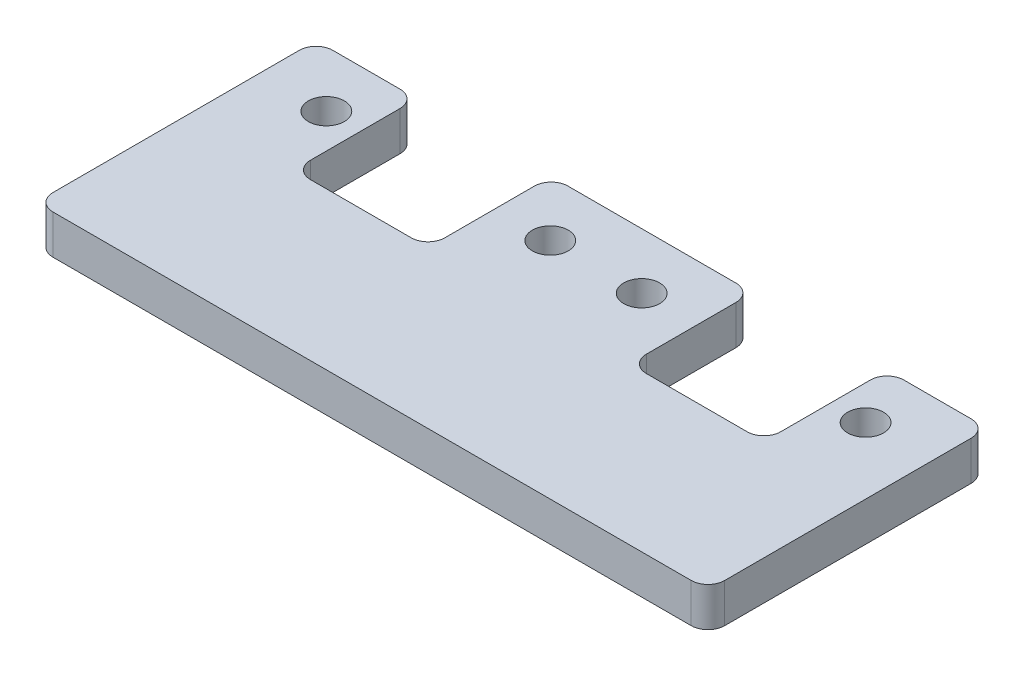
ISO-10303-21;
HEADER;
FILE_DESCRIPTION(('STEP AP214'),'2;1');
FILE_NAME('part.step','',(''),(''),'','','');
FILE_SCHEMA(('AUTOMOTIVE_DESIGN { 1 0 10303 214 1 1 1 1 }'));
ENDSEC;
DATA;
#1=APPLICATION_CONTEXT('core data for automotive mechanical design processes');
#2=APPLICATION_PROTOCOL_DEFINITION('international standard','automotive_design',2000,#1);
#3=PRODUCT_CONTEXT('',#1,'mechanical');
#4=PRODUCT('Part','Part','',(#3));
#5=PRODUCT_RELATED_PRODUCT_CATEGORY('part','',(#4));
#6=PRODUCT_DEFINITION_FORMATION('','',#4);
#7=PRODUCT_DEFINITION_CONTEXT('part definition',#1,'design');
#8=PRODUCT_DEFINITION('design','',#6,#7);
#9=PRODUCT_DEFINITION_SHAPE('','',#8);
#10=(LENGTH_UNIT() NAMED_UNIT(*) SI_UNIT(.MILLI.,.METRE.));
#11=(NAMED_UNIT(*) PLANE_ANGLE_UNIT() SI_UNIT($,.RADIAN.));
#12=(NAMED_UNIT(*) SI_UNIT($,.STERADIAN.) SOLID_ANGLE_UNIT());
#13=UNCERTAINTY_MEASURE_WITH_UNIT(LENGTH_MEASURE(1.E-05),#10,'distance_accuracy_value','');
#14=(GEOMETRIC_REPRESENTATION_CONTEXT(3) GLOBAL_UNCERTAINTY_ASSIGNED_CONTEXT((#13)) GLOBAL_UNIT_ASSIGNED_CONTEXT((#10,
#11,#12)) REPRESENTATION_CONTEXT('',''));
#15=CARTESIAN_POINT('',(0.,0.,0.));
#16=DIRECTION('',(0.,0.,1.));
#17=DIRECTION('',(1.,0.,0.));
#18=AXIS2_PLACEMENT_3D('',#15,#16,#17);
#19=CARTESIAN_POINT('',(21.,3.5,-12.5));
#20=DIRECTION('',(0.,0.,1.));
#21=DIRECTION('',(1.,0.,0.));
#22=AXIS2_PLACEMENT_3D('',#19,#20,#21);
#23=PLANE('',#22);
#24=DIRECTION('',(-1.,0.,0.));
#25=VECTOR('',#24,1.);
#26=CARTESIAN_POINT('',(21.,3.5,-12.5));
#27=LINE('',#26,#25);
#28=CARTESIAN_POINT('',(28.5,3.5,-12.5));
#29=VERTEX_POINT('',#28);
#30=CARTESIAN_POINT('',(22.5,3.5,-12.5));
#31=VERTEX_POINT('',#30);
#32=EDGE_CURVE('E222',#29,#31,#27,.T.);
#33=ORIENTED_EDGE('',*,*,#32,.F.);
#34=DIRECTION('',(0.,-1.,0.));
#35=VECTOR('',#34,1.);
#36=CARTESIAN_POINT('',(28.5,3.5,-12.5));
#37=LINE('',#36,#35);
#38=CARTESIAN_POINT('',(28.5,0.,-12.5));
#39=VERTEX_POINT('',#38);
#40=EDGE_CURVE('E207',#29,#39,#37,.T.);
#41=ORIENTED_EDGE('',*,*,#40,.T.);
#42=DIRECTION('',(-1.,0.,0.));
#43=VECTOR('',#42,1.);
#44=CARTESIAN_POINT('',(21.,0.,-12.5));
#45=LINE('',#44,#43);
#46=CARTESIAN_POINT('',(22.5,0.,-12.5));
#47=VERTEX_POINT('',#46);
#48=EDGE_CURVE('E219',#39,#47,#45,.T.);
#49=ORIENTED_EDGE('',*,*,#48,.T.);
#50=DIRECTION('',(0.,-1.,0.));
#51=VECTOR('',#50,1.);
#52=CARTESIAN_POINT('',(22.5,3.5,-12.5));
#53=LINE('',#52,#51);
#54=EDGE_CURVE('E224',#47,#31,#53,.F.);
#55=ORIENTED_EDGE('',*,*,#54,.T.);
#56=EDGE_LOOP('',(#33,#41,#49,#55));
#57=FACE_BOUND('',#56,.T.);
#58=ADVANCED_FACE('F41',(#57),#23,.F.);
#59=CARTESIAN_POINT('',(21.,3.5,-1.5));
#60=DIRECTION('',(1.,0.,0.));
#61=DIRECTION('',(0.,0.,-1.));
#62=AXIS2_PLACEMENT_3D('',#59,#60,#61);
#63=PLANE('',#62);
#64=DIRECTION('',(0.,0.,1.));
#65=VECTOR('',#64,1.);
#66=CARTESIAN_POINT('',(21.,0.,-1.5));
#67=LINE('',#66,#65);
#68=CARTESIAN_POINT('',(21.,0.,-11.));
#69=VERTEX_POINT('',#68);
#70=CARTESIAN_POINT('',(21.,0.,-3.));
#71=VERTEX_POINT('',#70);
#72=EDGE_CURVE('E229',#69,#71,#67,.T.);
#73=ORIENTED_EDGE('',*,*,#72,.T.);
#74=DIRECTION('',(0.,-1.,0.));
#75=VECTOR('',#74,1.);
#76=CARTESIAN_POINT('',(21.,3.5,-3.));
#77=LINE('',#76,#75);
#78=CARTESIAN_POINT('',(21.,3.5,-3.));
#79=VERTEX_POINT('',#78);
#80=EDGE_CURVE('E346',#71,#79,#77,.F.);
#81=ORIENTED_EDGE('',*,*,#80,.T.);
#82=DIRECTION('',(0.,0.,1.));
#83=VECTOR('',#82,1.);
#84=CARTESIAN_POINT('',(21.,3.5,-1.5));
#85=LINE('',#84,#83);
#86=CARTESIAN_POINT('',(21.,3.5,-11.));
#87=VERTEX_POINT('',#86);
#88=EDGE_CURVE('E376',#87,#79,#85,.T.);
#89=ORIENTED_EDGE('',*,*,#88,.F.);
#90=DIRECTION('',(0.,-1.,0.));
#91=VECTOR('',#90,1.);
#92=CARTESIAN_POINT('',(21.,3.5,-11.));
#93=LINE('',#92,#91);
#94=EDGE_CURVE('E343',#87,#69,#93,.T.);
#95=ORIENTED_EDGE('',*,*,#94,.T.);
#96=EDGE_LOOP('',(#73,#81,#89,#95));
#97=FACE_BOUND('',#96,.T.);
#98=ADVANCED_FACE('F364',(#97),#63,.F.);
#99=CARTESIAN_POINT('',(9.,3.5,-1.5));
#100=DIRECTION('',(0.,0.,1.));
#101=DIRECTION('',(1.,0.,0.));
#102=AXIS2_PLACEMENT_3D('',#99,#100,#101);
#103=PLANE('',#102);
#104=DIRECTION('',(-1.,0.,0.));
#105=VECTOR('',#104,1.);
#106=CARTESIAN_POINT('',(9.,0.,-1.5));
#107=LINE('',#106,#105);
#108=CARTESIAN_POINT('',(19.5,0.,-1.5));
#109=VERTEX_POINT('',#108);
#110=CARTESIAN_POINT('',(10.5,0.,-1.5));
#111=VERTEX_POINT('',#110);
#112=EDGE_CURVE('E233',#109,#111,#107,.T.);
#113=ORIENTED_EDGE('',*,*,#112,.T.);
#114=DIRECTION('',(0.,-1.,0.));
#115=VECTOR('',#114,1.);
#116=CARTESIAN_POINT('',(10.5,3.5,-1.5));
#117=LINE('',#116,#115);
#118=CARTESIAN_POINT('',(10.5,3.5,-1.5));
#119=VERTEX_POINT('',#118);
#120=EDGE_CURVE('E341',#111,#119,#117,.F.);
#121=ORIENTED_EDGE('',*,*,#120,.T.);
#122=DIRECTION('',(-1.,0.,0.));
#123=VECTOR('',#122,1.);
#124=CARTESIAN_POINT('',(9.,3.5,-1.5));
#125=LINE('',#124,#123);
#126=CARTESIAN_POINT('',(19.5,3.5,-1.5));
#127=VERTEX_POINT('',#126);
#128=EDGE_CURVE('E374',#127,#119,#125,.T.);
#129=ORIENTED_EDGE('',*,*,#128,.F.);
#130=DIRECTION('',(0.,-1.,0.));
#131=VECTOR('',#130,1.);
#132=CARTESIAN_POINT('',(19.5,0.,-1.5));
#133=LINE('',#132,#131);
#134=EDGE_CURVE('E338',#127,#109,#133,.T.);
#135=ORIENTED_EDGE('',*,*,#134,.T.);
#136=EDGE_LOOP('',(#113,#121,#129,#135));
#137=FACE_BOUND('',#136,.T.);
#138=ADVANCED_FACE('F378',(#137),#103,.F.);
#139=CARTESIAN_POINT('',(9.,3.5,-12.5));
#140=DIRECTION('',(-1.,0.,0.));
#141=DIRECTION('',(0.,0.,1.));
#142=AXIS2_PLACEMENT_3D('',#139,#140,#141);
#143=PLANE('',#142);
#144=DIRECTION('',(0.,0.,-1.));
#145=VECTOR('',#144,1.);
#146=CARTESIAN_POINT('',(9.,0.,-12.5));
#147=LINE('',#146,#145);
#148=CARTESIAN_POINT('',(9.,0.,-3.));
#149=VERTEX_POINT('',#148);
#150=CARTESIAN_POINT('',(9.,0.,-11.));
#151=VERTEX_POINT('',#150);
#152=EDGE_CURVE('E244',#149,#151,#147,.T.);
#153=ORIENTED_EDGE('',*,*,#152,.T.);
#154=DIRECTION('',(0.,-1.,0.));
#155=VECTOR('',#154,1.);
#156=CARTESIAN_POINT('',(9.,3.5,-11.));
#157=LINE('',#156,#155);
#158=CARTESIAN_POINT('',(9.,3.5,-11.));
#159=VERTEX_POINT('',#158);
#160=EDGE_CURVE('E336',#151,#159,#157,.F.);
#161=ORIENTED_EDGE('',*,*,#160,.T.);
#162=DIRECTION('',(0.,0.,-1.));
#163=VECTOR('',#162,1.);
#164=CARTESIAN_POINT('',(9.,3.5,-12.5));
#165=LINE('',#164,#163);
#166=CARTESIAN_POINT('',(9.,3.5,-3.));
#167=VERTEX_POINT('',#166);
#168=EDGE_CURVE('E380',#167,#159,#165,.T.);
#169=ORIENTED_EDGE('',*,*,#168,.F.);
#170=DIRECTION('',(0.,-1.,0.));
#171=VECTOR('',#170,1.);
#172=CARTESIAN_POINT('',(9.,0.,-3.));
#173=LINE('',#172,#171);
#174=EDGE_CURVE('E333',#167,#149,#173,.T.);
#175=ORIENTED_EDGE('',*,*,#174,.T.);
#176=EDGE_LOOP('',(#153,#161,#169,#175));
#177=FACE_BOUND('',#176,.T.);
#178=ADVANCED_FACE('F472',(#177),#143,.F.);
#179=CARTESIAN_POINT('',(-9.,3.5,-12.5));
#180=DIRECTION('',(0.,0.,1.));
#181=DIRECTION('',(1.,0.,0.));
#182=AXIS2_PLACEMENT_3D('',#179,#180,#181);
#183=PLANE('',#182);
#184=DIRECTION('',(-1.,0.,0.));
#185=VECTOR('',#184,1.);
#186=CARTESIAN_POINT('',(-9.,0.,-12.5));
#187=LINE('',#186,#185);
#188=CARTESIAN_POINT('',(7.5,0.,-12.5));
#189=VERTEX_POINT('',#188);
#190=CARTESIAN_POINT('',(-7.5,0.,-12.5));
#191=VERTEX_POINT('',#190);
#192=EDGE_CURVE('E247',#189,#191,#187,.T.);
#193=ORIENTED_EDGE('',*,*,#192,.T.);
#194=DIRECTION('',(0.,-1.,0.));
#195=VECTOR('',#194,1.);
#196=CARTESIAN_POINT('',(-7.5,3.5,-12.5));
#197=LINE('',#196,#195);
#198=CARTESIAN_POINT('',(-7.5,3.5,-12.5));
#199=VERTEX_POINT('',#198);
#200=EDGE_CURVE('E331',#191,#199,#197,.F.);
#201=ORIENTED_EDGE('',*,*,#200,.T.);
#202=DIRECTION('',(-1.,0.,0.));
#203=VECTOR('',#202,1.);
#204=CARTESIAN_POINT('',(-9.,3.5,-12.5));
#205=LINE('',#204,#203);
#206=CARTESIAN_POINT('',(7.5,3.5,-12.5));
#207=VERTEX_POINT('',#206);
#208=EDGE_CURVE('E383',#207,#199,#205,.T.);
#209=ORIENTED_EDGE('',*,*,#208,.F.);
#210=DIRECTION('',(0.,-1.,0.));
#211=VECTOR('',#210,1.);
#212=CARTESIAN_POINT('',(7.5,3.5,-12.5));
#213=LINE('',#212,#211);
#214=EDGE_CURVE('E328',#207,#189,#213,.T.);
#215=ORIENTED_EDGE('',*,*,#214,.T.);
#216=EDGE_LOOP('',(#193,#201,#209,#215));
#217=FACE_BOUND('',#216,.T.);
#218=ADVANCED_FACE('F463',(#217),#183,.F.);
#219=CARTESIAN_POINT('',(-8.99999999999999,3.5,-1.5));
#220=DIRECTION('',(1.,0.,0.));
#221=DIRECTION('',(0.,0.,-1.));
#222=AXIS2_PLACEMENT_3D('',#219,#220,#221);
#223=PLANE('',#222);
#224=DIRECTION('',(0.,0.,1.));
#225=VECTOR('',#224,1.);
#226=CARTESIAN_POINT('',(-8.99999999999999,0.,-1.5));
#227=LINE('',#226,#225);
#228=CARTESIAN_POINT('',(-9.,0.,-11.));
#229=VERTEX_POINT('',#228);
#230=CARTESIAN_POINT('',(-8.99999999999999,0.,-3.));
#231=VERTEX_POINT('',#230);
#232=EDGE_CURVE('E250',#229,#231,#227,.T.);
#233=ORIENTED_EDGE('',*,*,#232,.T.);
#234=DIRECTION('',(0.,-1.,0.));
#235=VECTOR('',#234,1.);
#236=CARTESIAN_POINT('',(-8.99999999999999,3.5,-3.));
#237=LINE('',#236,#235);
#238=CARTESIAN_POINT('',(-8.99999999999999,3.5,-3.));
#239=VERTEX_POINT('',#238);
#240=EDGE_CURVE('E326',#231,#239,#237,.F.);
#241=ORIENTED_EDGE('',*,*,#240,.T.);
#242=DIRECTION('',(0.,0.,1.));
#243=VECTOR('',#242,1.);
#244=CARTESIAN_POINT('',(-8.99999999999999,3.5,-1.5));
#245=LINE('',#244,#243);
#246=CARTESIAN_POINT('',(-9.,3.5,-11.));
#247=VERTEX_POINT('',#246);
#248=EDGE_CURVE('E390',#247,#239,#245,.T.);
#249=ORIENTED_EDGE('',*,*,#248,.F.);
#250=DIRECTION('',(0.,-1.,0.));
#251=VECTOR('',#250,1.);
#252=CARTESIAN_POINT('',(-9.,3.5,-11.));
#253=LINE('',#252,#251);
#254=EDGE_CURVE('E323',#247,#229,#253,.T.);
#255=ORIENTED_EDGE('',*,*,#254,.T.);
#256=EDGE_LOOP('',(#233,#241,#249,#255));
#257=FACE_BOUND('',#256,.T.);
#258=ADVANCED_FACE('F454',(#257),#223,.F.);
#259=CARTESIAN_POINT('',(-21.,3.5,-1.5));
#260=DIRECTION('',(0.,0.,1.));
#261=DIRECTION('',(1.,0.,0.));
#262=AXIS2_PLACEMENT_3D('',#259,#260,#261);
#263=PLANE('',#262);
#264=DIRECTION('',(-1.,0.,0.));
#265=VECTOR('',#264,1.);
#266=CARTESIAN_POINT('',(-21.,0.,-1.5));
#267=LINE('',#266,#265);
#268=CARTESIAN_POINT('',(-10.5,0.,-1.5));
#269=VERTEX_POINT('',#268);
#270=CARTESIAN_POINT('',(-19.5,0.,-1.5));
#271=VERTEX_POINT('',#270);
#272=EDGE_CURVE('E253',#269,#271,#267,.T.);
#273=ORIENTED_EDGE('',*,*,#272,.T.);
#274=DIRECTION('',(0.,-1.,0.));
#275=VECTOR('',#274,1.);
#276=CARTESIAN_POINT('',(-19.5,3.5,-1.5));
#277=LINE('',#276,#275);
#278=CARTESIAN_POINT('',(-19.5,3.5,-1.5));
#279=VERTEX_POINT('',#278);
#280=EDGE_CURVE('E321',#271,#279,#277,.F.);
#281=ORIENTED_EDGE('',*,*,#280,.T.);
#282=DIRECTION('',(-1.,0.,0.));
#283=VECTOR('',#282,1.);
#284=CARTESIAN_POINT('',(-21.,3.5,-1.5));
#285=LINE('',#284,#283);
#286=CARTESIAN_POINT('',(-10.5,3.5,-1.5));
#287=VERTEX_POINT('',#286);
#288=EDGE_CURVE('E393',#287,#279,#285,.T.);
#289=ORIENTED_EDGE('',*,*,#288,.F.);
#290=DIRECTION('',(0.,-1.,0.));
#291=VECTOR('',#290,1.);
#292=CARTESIAN_POINT('',(-10.5,0.,-1.5));
#293=LINE('',#292,#291);
#294=EDGE_CURVE('E318',#287,#269,#293,.T.);
#295=ORIENTED_EDGE('',*,*,#294,.T.);
#296=EDGE_LOOP('',(#273,#281,#289,#295));
#297=FACE_BOUND('',#296,.T.);
#298=ADVANCED_FACE('F445',(#297),#263,.F.);
#299=CARTESIAN_POINT('',(-21.,3.5,-12.5));
#300=DIRECTION('',(-1.,0.,0.));
#301=DIRECTION('',(0.,0.,1.));
#302=AXIS2_PLACEMENT_3D('',#299,#300,#301);
#303=PLANE('',#302);
#304=DIRECTION('',(0.,0.,-1.));
#305=VECTOR('',#304,1.);
#306=CARTESIAN_POINT('',(-21.,0.,-12.5));
#307=LINE('',#306,#305);
#308=CARTESIAN_POINT('',(-21.,0.,-3.));
#309=VERTEX_POINT('',#308);
#310=CARTESIAN_POINT('',(-21.,0.,-11.));
#311=VERTEX_POINT('',#310);
#312=EDGE_CURVE('E256',#309,#311,#307,.T.);
#313=ORIENTED_EDGE('',*,*,#312,.T.);
#314=DIRECTION('',(0.,-1.,0.));
#315=VECTOR('',#314,1.);
#316=CARTESIAN_POINT('',(-21.,3.5,-11.));
#317=LINE('',#316,#315);
#318=CARTESIAN_POINT('',(-21.,3.5,-11.));
#319=VERTEX_POINT('',#318);
#320=EDGE_CURVE('E316',#311,#319,#317,.F.);
#321=ORIENTED_EDGE('',*,*,#320,.T.);
#322=DIRECTION('',(0.,0.,-1.));
#323=VECTOR('',#322,1.);
#324=CARTESIAN_POINT('',(-21.,3.5,-12.5));
#325=LINE('',#324,#323);
#326=CARTESIAN_POINT('',(-21.,3.5,-3.));
#327=VERTEX_POINT('',#326);
#328=EDGE_CURVE('E396',#327,#319,#325,.T.);
#329=ORIENTED_EDGE('',*,*,#328,.F.);
#330=DIRECTION('',(0.,-1.,0.));
#331=VECTOR('',#330,1.);
#332=CARTESIAN_POINT('',(-21.,0.,-3.));
#333=LINE('',#332,#331);
#334=EDGE_CURVE('E313',#327,#309,#333,.T.);
#335=ORIENTED_EDGE('',*,*,#334,.T.);
#336=EDGE_LOOP('',(#313,#321,#329,#335));
#337=FACE_BOUND('',#336,.T.);
#338=ADVANCED_FACE('F436',(#337),#303,.F.);
#339=CARTESIAN_POINT('',(-30.,3.5,-12.5));
#340=DIRECTION('',(0.,0.,1.));
#341=DIRECTION('',(1.,0.,0.));
#342=AXIS2_PLACEMENT_3D('',#339,#340,#341);
#343=PLANE('',#342);
#344=DIRECTION('',(-1.,0.,0.));
#345=VECTOR('',#344,1.);
#346=CARTESIAN_POINT('',(-30.,0.,-12.5));
#347=LINE('',#346,#345);
#348=CARTESIAN_POINT('',(-22.5,0.,-12.5));
#349=VERTEX_POINT('',#348);
#350=CARTESIAN_POINT('',(-28.5,0.,-12.5));
#351=VERTEX_POINT('',#350);
#352=EDGE_CURVE('E259',#349,#351,#347,.T.);
#353=ORIENTED_EDGE('',*,*,#352,.T.);
#354=DIRECTION('',(0.,-1.,0.));
#355=VECTOR('',#354,1.);
#356=CARTESIAN_POINT('',(-28.5,3.5,-12.5));
#357=LINE('',#356,#355);
#358=CARTESIAN_POINT('',(-28.5,3.5,-12.5));
#359=VERTEX_POINT('',#358);
#360=EDGE_CURVE('E311',#351,#359,#357,.F.);
#361=ORIENTED_EDGE('',*,*,#360,.T.);
#362=DIRECTION('',(-1.,0.,0.));
#363=VECTOR('',#362,1.);
#364=CARTESIAN_POINT('',(-30.,3.5,-12.5));
#365=LINE('',#364,#363);
#366=CARTESIAN_POINT('',(-22.5,3.5,-12.5));
#367=VERTEX_POINT('',#366);
#368=EDGE_CURVE('E399',#367,#359,#365,.T.);
#369=ORIENTED_EDGE('',*,*,#368,.F.);
#370=DIRECTION('',(0.,-1.,0.));
#371=VECTOR('',#370,1.);
#372=CARTESIAN_POINT('',(-22.5,3.5,-12.5));
#373=LINE('',#372,#371);
#374=EDGE_CURVE('E308',#367,#349,#373,.T.);
#375=ORIENTED_EDGE('',*,*,#374,.T.);
#376=EDGE_LOOP('',(#353,#361,#369,#375));
#377=FACE_BOUND('',#376,.T.);
#378=ADVANCED_FACE('F427',(#377),#343,.F.);
#379=CARTESIAN_POINT('',(-30.,3.5,12.5));
#380=DIRECTION('',(1.,0.,0.));
#381=DIRECTION('',(0.,0.,-1.));
#382=AXIS2_PLACEMENT_3D('',#379,#380,#381);
#383=PLANE('',#382);
#384=DIRECTION('',(0.,0.,1.));
#385=VECTOR('',#384,1.);
#386=CARTESIAN_POINT('',(-30.,3.5,12.5));
#387=LINE('',#386,#385);
#388=CARTESIAN_POINT('',(-30.,3.5,-11.));
#389=VERTEX_POINT('',#388);
#390=CARTESIAN_POINT('',(-30.,3.5,11.));
#391=VERTEX_POINT('',#390);
#392=EDGE_CURVE('E402',#389,#391,#387,.T.);
#393=ORIENTED_EDGE('',*,*,#392,.F.);
#394=DIRECTION('',(0.,-1.,0.));
#395=VECTOR('',#394,1.);
#396=CARTESIAN_POINT('',(-30.,3.5,-11.));
#397=LINE('',#396,#395);
#398=CARTESIAN_POINT('',(-30.,0.,-11.));
#399=VERTEX_POINT('',#398);
#400=EDGE_CURVE('E305',#389,#399,#397,.T.);
#401=ORIENTED_EDGE('',*,*,#400,.T.);
#402=DIRECTION('',(0.,0.,1.));
#403=VECTOR('',#402,1.);
#404=CARTESIAN_POINT('',(-30.,0.,12.5));
#405=LINE('',#404,#403);
#406=CARTESIAN_POINT('',(-30.,0.,11.));
#407=VERTEX_POINT('',#406);
#408=EDGE_CURVE('E262',#399,#407,#405,.T.);
#409=ORIENTED_EDGE('',*,*,#408,.T.);
#410=DIRECTION('',(0.,-1.,0.));
#411=VECTOR('',#410,1.);
#412=CARTESIAN_POINT('',(-30.,3.5,11.));
#413=LINE('',#412,#411);
#414=EDGE_CURVE('E303',#407,#391,#413,.F.);
#415=ORIENTED_EDGE('',*,*,#414,.T.);
#416=EDGE_LOOP('',(#393,#401,#409,#415));
#417=FACE_BOUND('',#416,.T.);
#418=ADVANCED_FACE('F419',(#417),#383,.F.);
#419=CARTESIAN_POINT('',(-30.,3.5,12.5));
#420=DIRECTION('',(0.,0.,-1.));
#421=DIRECTION('',(-1.,0.,0.));
#422=AXIS2_PLACEMENT_3D('',#419,#420,#421);
#423=PLANE('',#422);
#424=DIRECTION('',(1.,0.,0.));
#425=VECTOR('',#424,1.);
#426=CARTESIAN_POINT('',(-30.,0.,12.5));
#427=LINE('',#426,#425);
#428=CARTESIAN_POINT('',(-28.5,0.,12.5));
#429=VERTEX_POINT('',#428);
#430=CARTESIAN_POINT('',(28.5,0.,12.5));
#431=VERTEX_POINT('',#430);
#432=EDGE_CURVE('E265',#429,#431,#427,.T.);
#433=ORIENTED_EDGE('',*,*,#432,.T.);
#434=DIRECTION('',(0.,-1.,0.));
#435=VECTOR('',#434,1.);
#436=CARTESIAN_POINT('',(28.5,3.5,12.5));
#437=LINE('',#436,#435);
#438=CARTESIAN_POINT('',(28.5,3.5,12.5));
#439=VERTEX_POINT('',#438);
#440=EDGE_CURVE('E56',#431,#439,#437,.F.);
#441=ORIENTED_EDGE('',*,*,#440,.T.);
#442=DIRECTION('',(1.,0.,0.));
#443=VECTOR('',#442,1.);
#444=CARTESIAN_POINT('',(-30.,3.5,12.5));
#445=LINE('',#444,#443);
#446=CARTESIAN_POINT('',(-28.5,3.5,12.5));
#447=VERTEX_POINT('',#446);
#448=EDGE_CURVE('E403',#447,#439,#445,.T.);
#449=ORIENTED_EDGE('',*,*,#448,.F.);
#450=DIRECTION('',(0.,-1.,0.));
#451=VECTOR('',#450,1.);
#452=CARTESIAN_POINT('',(-28.5,3.5,12.5));
#453=LINE('',#452,#451);
#454=EDGE_CURVE('E299',#447,#429,#453,.T.);
#455=ORIENTED_EDGE('',*,*,#454,.T.);
#456=EDGE_LOOP('',(#433,#441,#449,#455));
#457=FACE_BOUND('',#456,.T.);
#458=ADVANCED_FACE('F412',(#457),#423,.F.);
#459=CARTESIAN_POINT('',(30.,3.5,12.5));
#460=DIRECTION('',(-1.,0.,0.));
#461=DIRECTION('',(0.,0.,1.));
#462=AXIS2_PLACEMENT_3D('',#459,#460,#461);
#463=PLANE('',#462);
#464=DIRECTION('',(0.,0.,-1.));
#465=VECTOR('',#464,1.);
#466=CARTESIAN_POINT('',(30.,0.,12.5));
#467=LINE('',#466,#465);
#468=CARTESIAN_POINT('',(30.,0.,11.));
#469=VERTEX_POINT('',#468);
#470=CARTESIAN_POINT('',(30.,0.,-11.));
#471=VERTEX_POINT('',#470);
#472=EDGE_CURVE('E267',#469,#471,#467,.T.);
#473=ORIENTED_EDGE('',*,*,#472,.T.);
#474=DIRECTION('',(0.,-1.,0.));
#475=VECTOR('',#474,1.);
#476=CARTESIAN_POINT('',(30.,3.5,-11.));
#477=LINE('',#476,#475);
#478=CARTESIAN_POINT('',(30.,3.5,-11.));
#479=VERTEX_POINT('',#478);
#480=EDGE_CURVE('E208',#471,#479,#477,.F.);
#481=ORIENTED_EDGE('',*,*,#480,.T.);
#482=DIRECTION('',(0.,0.,-1.));
#483=VECTOR('',#482,1.);
#484=CARTESIAN_POINT('',(30.,3.5,12.5));
#485=LINE('',#484,#483);
#486=CARTESIAN_POINT('',(30.,3.5,11.));
#487=VERTEX_POINT('',#486);
#488=EDGE_CURVE('E239',#487,#479,#485,.T.);
#489=ORIENTED_EDGE('',*,*,#488,.F.);
#490=DIRECTION('',(0.,-1.,0.));
#491=VECTOR('',#490,1.);
#492=CARTESIAN_POINT('',(30.,3.5,11.));
#493=LINE('',#492,#491);
#494=EDGE_CURVE('E213',#487,#469,#493,.T.);
#495=ORIENTED_EDGE('',*,*,#494,.T.);
#496=EDGE_LOOP('',(#473,#481,#489,#495));
#497=FACE_BOUND('',#496,.T.);
#498=ADVANCED_FACE('F408',(#497),#463,.F.);
#499=CARTESIAN_POINT('',(0.,3.5,0.));
#500=DIRECTION('',(0.,1.,0.));
#501=DIRECTION('',(0.,0.,1.));
#502=AXIS2_PLACEMENT_3D('',#499,#500,#501);
#503=PLANE('',#502);
#504=CARTESIAN_POINT('',(-24.079999968,3.5,-7.5));
#505=DIRECTION('',(0.,1.,0.));
#506=DIRECTION('',(0.,0.,1.));
#507=AXIS2_PLACEMENT_3D('',#504,#505,#506);
#508=CIRCLE('',#507,1.60655);
#509=CARTESIAN_POINT('',(-24.079999968,3.5,-5.89345));
#510=VERTEX_POINT('',#509);
#511=EDGE_CURVE('E566',#510,#510,#508,.T.);
#512=ORIENTED_EDGE('',*,*,#511,.F.);
#513=EDGE_LOOP('',(#512));
#514=FACE_BOUND('',#513,.T.);
#515=CARTESIAN_POINT('',(-4.079999968,3.5,-7.5));
#516=DIRECTION('',(0.,1.,0.));
#517=DIRECTION('',(0.,0.,1.));
#518=AXIS2_PLACEMENT_3D('',#515,#516,#517);
#519=CIRCLE('',#518,1.60655);
#520=CARTESIAN_POINT('',(-4.079999968,3.5,-5.89345));
#521=VERTEX_POINT('',#520);
#522=EDGE_CURVE('E560',#521,#521,#519,.T.);
#523=ORIENTED_EDGE('',*,*,#522,.F.);
#524=EDGE_LOOP('',(#523));
#525=FACE_BOUND('',#524,.T.);
#526=CARTESIAN_POINT('',(4.079999968,3.5,-7.5));
#527=DIRECTION('',(0.,1.,0.));
#528=DIRECTION('',(0.,0.,1.));
#529=AXIS2_PLACEMENT_3D('',#526,#527,#528);
#530=CIRCLE('',#529,1.60655);
#531=CARTESIAN_POINT('',(4.079999968,3.5,-5.89345));
#532=VERTEX_POINT('',#531);
#533=EDGE_CURVE('E554',#532,#532,#530,.T.);
#534=ORIENTED_EDGE('',*,*,#533,.F.);
#535=EDGE_LOOP('',(#534));
#536=FACE_BOUND('',#535,.T.);
#537=CARTESIAN_POINT('',(24.079999968,3.5,-7.5));
#538=DIRECTION('',(0.,1.,0.));
#539=DIRECTION('',(0.,0.,1.));
#540=AXIS2_PLACEMENT_3D('',#537,#538,#539);
#541=CIRCLE('',#540,1.60655);
#542=CARTESIAN_POINT('',(24.079999968,3.5,-5.89345));
#543=VERTEX_POINT('',#542);
#544=EDGE_CURVE('E236',#543,#543,#541,.T.);
#545=ORIENTED_EDGE('',*,*,#544,.F.);
#546=EDGE_LOOP('',(#545));
#547=FACE_BOUND('',#546,.T.);
#548=ORIENTED_EDGE('',*,*,#488,.T.);
#549=CARTESIAN_POINT('',(28.5,3.5,-11.));
#550=DIRECTION('',(0.,1.,0.));
#551=DIRECTION('',(0.,0.,1.));
#552=AXIS2_PLACEMENT_3D('',#549,#550,#551);
#553=CIRCLE('',#552,1.5);
#554=EDGE_CURVE('E297',#479,#29,#553,.T.);
#555=ORIENTED_EDGE('',*,*,#554,.T.);
#556=ORIENTED_EDGE('',*,*,#32,.T.);
#557=CARTESIAN_POINT('',(22.5,3.5,-11.));
#558=DIRECTION('',(0.,1.,0.));
#559=DIRECTION('',(0.,0.,1.));
#560=AXIS2_PLACEMENT_3D('',#557,#558,#559);
#561=CIRCLE('',#560,1.5);
#562=EDGE_CURVE('E285',#31,#87,#561,.T.);
#563=ORIENTED_EDGE('',*,*,#562,.T.);
#564=ORIENTED_EDGE('',*,*,#88,.T.);
#565=CARTESIAN_POINT('',(19.5,3.5,-3.));
#566=DIRECTION('',(0.,1.,0.));
#567=DIRECTION('',(0.,0.,1.));
#568=AXIS2_PLACEMENT_3D('',#565,#566,#567);
#569=CIRCLE('',#568,1.5);
#570=EDGE_CURVE('E11',#79,#127,#569,.F.);
#571=ORIENTED_EDGE('',*,*,#570,.T.);
#572=ORIENTED_EDGE('',*,*,#128,.T.);
#573=CARTESIAN_POINT('',(10.5,3.5,-3.));
#574=DIRECTION('',(0.,1.,0.));
#575=DIRECTION('',(0.,0.,1.));
#576=AXIS2_PLACEMENT_3D('',#573,#574,#575);
#577=CIRCLE('',#576,1.5);
#578=EDGE_CURVE('E358',#119,#167,#577,.F.);
#579=ORIENTED_EDGE('',*,*,#578,.T.);
#580=ORIENTED_EDGE('',*,*,#168,.T.);
#581=CARTESIAN_POINT('',(7.5,3.5,-11.));
#582=DIRECTION('',(0.,1.,0.));
#583=DIRECTION('',(0.,0.,1.));
#584=AXIS2_PLACEMENT_3D('',#581,#582,#583);
#585=CIRCLE('',#584,1.5);
#586=EDGE_CURVE('E287',#159,#207,#585,.T.);
#587=ORIENTED_EDGE('',*,*,#586,.T.);
#588=ORIENTED_EDGE('',*,*,#208,.T.);
#589=CARTESIAN_POINT('',(-7.5,3.5,-11.));
#590=DIRECTION('',(0.,1.,0.));
#591=DIRECTION('',(0.,0.,1.));
#592=AXIS2_PLACEMENT_3D('',#589,#590,#591);
#593=CIRCLE('',#592,1.5);
#594=EDGE_CURVE('E289',#199,#247,#593,.T.);
#595=ORIENTED_EDGE('',*,*,#594,.T.);
#596=ORIENTED_EDGE('',*,*,#248,.T.);
#597=CARTESIAN_POINT('',(-10.5,3.5,-3.));
#598=DIRECTION('',(0.,1.,0.));
#599=DIRECTION('',(0.,0.,1.));
#600=AXIS2_PLACEMENT_3D('',#597,#598,#599);
#601=CIRCLE('',#600,1.5);
#602=EDGE_CURVE('E354',#239,#287,#601,.F.);
#603=ORIENTED_EDGE('',*,*,#602,.T.);
#604=ORIENTED_EDGE('',*,*,#288,.T.);
#605=CARTESIAN_POINT('',(-19.5,3.5,-3.));
#606=DIRECTION('',(0.,1.,0.));
#607=DIRECTION('',(0.,0.,1.));
#608=AXIS2_PLACEMENT_3D('',#605,#606,#607);
#609=CIRCLE('',#608,1.5);
#610=EDGE_CURVE('E350',#279,#327,#609,.F.);
#611=ORIENTED_EDGE('',*,*,#610,.T.);
#612=ORIENTED_EDGE('',*,*,#328,.T.);
#613=CARTESIAN_POINT('',(-22.5,3.5,-11.));
#614=DIRECTION('',(0.,1.,0.));
#615=DIRECTION('',(0.,0.,1.));
#616=AXIS2_PLACEMENT_3D('',#613,#614,#615);
#617=CIRCLE('',#616,1.5);
#618=EDGE_CURVE('E291',#319,#367,#617,.T.);
#619=ORIENTED_EDGE('',*,*,#618,.T.);
#620=ORIENTED_EDGE('',*,*,#368,.T.);
#621=CARTESIAN_POINT('',(-28.5,3.5,-11.));
#622=DIRECTION('',(0.,1.,0.));
#623=DIRECTION('',(0.,0.,1.));
#624=AXIS2_PLACEMENT_3D('',#621,#622,#623);
#625=CIRCLE('',#624,1.5);
#626=EDGE_CURVE('E293',#359,#389,#625,.T.);
#627=ORIENTED_EDGE('',*,*,#626,.T.);
#628=ORIENTED_EDGE('',*,*,#392,.T.);
#629=CARTESIAN_POINT('',(-28.5,3.5,11.));
#630=DIRECTION('',(0.,1.,0.));
#631=DIRECTION('',(0.,0.,1.));
#632=AXIS2_PLACEMENT_3D('',#629,#630,#631);
#633=CIRCLE('',#632,1.5);
#634=EDGE_CURVE('E63',#391,#447,#633,.T.);
#635=ORIENTED_EDGE('',*,*,#634,.T.);
#636=ORIENTED_EDGE('',*,*,#448,.T.);
#637=CARTESIAN_POINT('',(28.5,3.5,11.));
#638=DIRECTION('',(0.,1.,0.));
#639=DIRECTION('',(0.,0.,1.));
#640=AXIS2_PLACEMENT_3D('',#637,#638,#639);
#641=CIRCLE('',#640,1.5);
#642=EDGE_CURVE('E295',#439,#487,#641,.T.);
#643=ORIENTED_EDGE('',*,*,#642,.T.);
#644=EDGE_LOOP('',(#548,#555,#556,#563,#564,#571,#572,#579,#580,#587,#588,#595,#596,#603,#604,
#611,#612,#619,#620,#627,#628,#635,#636,#643));
#645=FACE_BOUND('',#644,.T.);
#646=ADVANCED_FACE('F373',(#514,#525,#536,#547,#645),#503,.T.);
#647=CARTESIAN_POINT('',(0.,0.,0.));
#648=DIRECTION('',(0.,1.,0.));
#649=DIRECTION('',(0.,0.,1.));
#650=AXIS2_PLACEMENT_3D('',#647,#648,#649);
#651=PLANE('',#650);
#652=CARTESIAN_POINT('',(-24.079999968,0.,-7.5));
#653=DIRECTION('',(0.,1.,0.));
#654=DIRECTION('',(0.,0.,1.));
#655=AXIS2_PLACEMENT_3D('',#652,#653,#654);
#656=CIRCLE('',#655,1.60655);
#657=CARTESIAN_POINT('',(-24.079999968,0.,-5.89345));
#658=VERTEX_POINT('',#657);
#659=EDGE_CURVE('E563',#658,#658,#656,.T.);
#660=ORIENTED_EDGE('',*,*,#659,.T.);
#661=EDGE_LOOP('',(#660));
#662=FACE_BOUND('',#661,.T.);
#663=CARTESIAN_POINT('',(-4.079999968,0.,-7.5));
#664=DIRECTION('',(0.,1.,0.));
#665=DIRECTION('',(0.,0.,1.));
#666=AXIS2_PLACEMENT_3D('',#663,#664,#665);
#667=CIRCLE('',#666,1.60655);
#668=CARTESIAN_POINT('',(-4.079999968,0.,-5.89345));
#669=VERTEX_POINT('',#668);
#670=EDGE_CURVE('E557',#669,#669,#667,.T.);
#671=ORIENTED_EDGE('',*,*,#670,.T.);
#672=EDGE_LOOP('',(#671));
#673=FACE_BOUND('',#672,.T.);
#674=CARTESIAN_POINT('',(4.079999968,0.,-7.5));
#675=DIRECTION('',(0.,1.,0.));
#676=DIRECTION('',(0.,0.,1.));
#677=AXIS2_PLACEMENT_3D('',#674,#675,#676);
#678=CIRCLE('',#677,1.60655);
#679=CARTESIAN_POINT('',(4.079999968,0.,-5.89345));
#680=VERTEX_POINT('',#679);
#681=EDGE_CURVE('E551',#680,#680,#678,.T.);
#682=ORIENTED_EDGE('',*,*,#681,.T.);
#683=EDGE_LOOP('',(#682));
#684=FACE_BOUND('',#683,.T.);
#685=CARTESIAN_POINT('',(24.079999968,0.,-7.5));
#686=DIRECTION('',(0.,1.,0.));
#687=DIRECTION('',(0.,0.,1.));
#688=AXIS2_PLACEMENT_3D('',#685,#686,#687);
#689=CIRCLE('',#688,1.60655);
#690=CARTESIAN_POINT('',(24.079999968,0.,-5.89345));
#691=VERTEX_POINT('',#690);
#692=EDGE_CURVE('E230',#691,#691,#689,.T.);
#693=ORIENTED_EDGE('',*,*,#692,.T.);
#694=EDGE_LOOP('',(#693));
#695=FACE_BOUND('',#694,.T.);
#696=ORIENTED_EDGE('',*,*,#48,.F.);
#697=CARTESIAN_POINT('',(28.5,0.,-11.));
#698=DIRECTION('',(0.,1.,0.));
#699=DIRECTION('',(0.,0.,1.));
#700=AXIS2_PLACEMENT_3D('',#697,#698,#699);
#701=CIRCLE('',#700,1.5);
#702=EDGE_CURVE('E203',#39,#471,#701,.F.);
#703=ORIENTED_EDGE('',*,*,#702,.T.);
#704=ORIENTED_EDGE('',*,*,#472,.F.);
#705=CARTESIAN_POINT('',(28.5,0.,11.));
#706=DIRECTION('',(0.,1.,0.));
#707=DIRECTION('',(0.,0.,1.));
#708=AXIS2_PLACEMENT_3D('',#705,#706,#707);
#709=CIRCLE('',#708,1.5);
#710=EDGE_CURVE('E214',#469,#431,#709,.F.);
#711=ORIENTED_EDGE('',*,*,#710,.T.);
#712=ORIENTED_EDGE('',*,*,#432,.F.);
#713=CARTESIAN_POINT('',(-28.5,0.,11.));
#714=DIRECTION('',(0.,1.,0.));
#715=DIRECTION('',(0.,0.,1.));
#716=AXIS2_PLACEMENT_3D('',#713,#714,#715);
#717=CIRCLE('',#716,1.5);
#718=EDGE_CURVE('E223',#429,#407,#717,.F.);
#719=ORIENTED_EDGE('',*,*,#718,.T.);
#720=ORIENTED_EDGE('',*,*,#408,.F.);
#721=CARTESIAN_POINT('',(-28.5,0.,-11.));
#722=DIRECTION('',(0.,1.,0.));
#723=DIRECTION('',(0.,0.,1.));
#724=AXIS2_PLACEMENT_3D('',#721,#722,#723);
#725=CIRCLE('',#724,1.5);
#726=EDGE_CURVE('E278',#399,#351,#725,.F.);
#727=ORIENTED_EDGE('',*,*,#726,.T.);
#728=ORIENTED_EDGE('',*,*,#352,.F.);
#729=CARTESIAN_POINT('',(-22.5,0.,-11.));
#730=DIRECTION('',(0.,1.,0.));
#731=DIRECTION('',(0.,0.,1.));
#732=AXIS2_PLACEMENT_3D('',#729,#730,#731);
#733=CIRCLE('',#732,1.5);
#734=EDGE_CURVE('E276',#349,#311,#733,.F.);
#735=ORIENTED_EDGE('',*,*,#734,.T.);
#736=ORIENTED_EDGE('',*,*,#312,.F.);
#737=CARTESIAN_POINT('',(-19.5,0.,-3.));
#738=DIRECTION('',(0.,1.,0.));
#739=DIRECTION('',(0.,0.,1.));
#740=AXIS2_PLACEMENT_3D('',#737,#738,#739);
#741=CIRCLE('',#740,1.5);
#742=EDGE_CURVE('E348',#309,#271,#741,.T.);
#743=ORIENTED_EDGE('',*,*,#742,.T.);
#744=ORIENTED_EDGE('',*,*,#272,.F.);
#745=CARTESIAN_POINT('',(-10.5,0.,-3.));
#746=DIRECTION('',(0.,1.,0.));
#747=DIRECTION('',(0.,0.,1.));
#748=AXIS2_PLACEMENT_3D('',#745,#746,#747);
#749=CIRCLE('',#748,1.5);
#750=EDGE_CURVE('E352',#269,#231,#749,.T.);
#751=ORIENTED_EDGE('',*,*,#750,.T.);
#752=ORIENTED_EDGE('',*,*,#232,.F.);
#753=CARTESIAN_POINT('',(-7.5,0.,-11.));
#754=DIRECTION('',(0.,1.,0.));
#755=DIRECTION('',(0.,0.,1.));
#756=AXIS2_PLACEMENT_3D('',#753,#754,#755);
#757=CIRCLE('',#756,1.5);
#758=EDGE_CURVE('E274',#229,#191,#757,.F.);
#759=ORIENTED_EDGE('',*,*,#758,.T.);
#760=ORIENTED_EDGE('',*,*,#192,.F.);
#761=CARTESIAN_POINT('',(7.5,0.,-11.));
#762=DIRECTION('',(0.,1.,0.));
#763=DIRECTION('',(0.,0.,1.));
#764=AXIS2_PLACEMENT_3D('',#761,#762,#763);
#765=CIRCLE('',#764,1.5);
#766=EDGE_CURVE('E272',#189,#151,#765,.F.);
#767=ORIENTED_EDGE('',*,*,#766,.T.);
#768=ORIENTED_EDGE('',*,*,#152,.F.);
#769=CARTESIAN_POINT('',(10.5,0.,-3.));
#770=DIRECTION('',(0.,1.,0.));
#771=DIRECTION('',(0.,0.,1.));
#772=AXIS2_PLACEMENT_3D('',#769,#770,#771);
#773=CIRCLE('',#772,1.5);
#774=EDGE_CURVE('E356',#149,#111,#773,.T.);
#775=ORIENTED_EDGE('',*,*,#774,.T.);
#776=ORIENTED_EDGE('',*,*,#112,.F.);
#777=CARTESIAN_POINT('',(19.5,0.,-3.));
#778=DIRECTION('',(0.,1.,0.));
#779=DIRECTION('',(0.,0.,1.));
#780=AXIS2_PLACEMENT_3D('',#777,#778,#779);
#781=CIRCLE('',#780,1.5);
#782=EDGE_CURVE('E49',#109,#71,#781,.T.);
#783=ORIENTED_EDGE('',*,*,#782,.T.);
#784=ORIENTED_EDGE('',*,*,#72,.F.);
#785=CARTESIAN_POINT('',(22.5,0.,-11.));
#786=DIRECTION('',(0.,1.,0.));
#787=DIRECTION('',(0.,0.,1.));
#788=AXIS2_PLACEMENT_3D('',#785,#786,#787);
#789=CIRCLE('',#788,1.5);
#790=EDGE_CURVE('E228',#69,#47,#789,.F.);
#791=ORIENTED_EDGE('',*,*,#790,.T.);
#792=EDGE_LOOP('',(#696,#703,#704,#711,#712,#719,#720,#727,#728,#735,#736,#743,#744,#751,#752,
#759,#760,#767,#768,#775,#776,#783,#784,#791));
#793=FACE_BOUND('',#792,.T.);
#794=ADVANCED_FACE('F226',(#662,#673,#684,#695,#793),#651,.F.);
#795=CARTESIAN_POINT('',(24.079999968,3.5,-7.5));
#796=DIRECTION('',(0.,1.,0.));
#797=DIRECTION('',(0.,0.,1.));
#798=AXIS2_PLACEMENT_3D('',#795,#796,#797);
#799=CYLINDRICAL_SURFACE('',#798,1.60655);
#800=ORIENTED_EDGE('',*,*,#692,.F.);
#801=EDGE_LOOP('',(#800));
#802=FACE_BOUND('',#801,.T.);
#803=ORIENTED_EDGE('',*,*,#544,.T.);
#804=EDGE_LOOP('',(#803));
#805=FACE_BOUND('',#804,.T.);
#806=ADVANCED_FACE('F580',(#802,#805),#799,.F.);
#807=CARTESIAN_POINT('',(4.079999968,3.5,-7.5));
#808=DIRECTION('',(0.,1.,0.));
#809=DIRECTION('',(0.,0.,1.));
#810=AXIS2_PLACEMENT_3D('',#807,#808,#809);
#811=CYLINDRICAL_SURFACE('',#810,1.60655);
#812=ORIENTED_EDGE('',*,*,#681,.F.);
#813=EDGE_LOOP('',(#812));
#814=FACE_BOUND('',#813,.T.);
#815=ORIENTED_EDGE('',*,*,#533,.T.);
#816=EDGE_LOOP('',(#815));
#817=FACE_BOUND('',#816,.T.);
#818=ADVANCED_FACE('F582',(#814,#817),#811,.F.);
#819=CARTESIAN_POINT('',(-4.079999968,3.5,-7.5));
#820=DIRECTION('',(0.,1.,0.));
#821=DIRECTION('',(0.,0.,1.));
#822=AXIS2_PLACEMENT_3D('',#819,#820,#821);
#823=CYLINDRICAL_SURFACE('',#822,1.60655);
#824=ORIENTED_EDGE('',*,*,#670,.F.);
#825=EDGE_LOOP('',(#824));
#826=FACE_BOUND('',#825,.T.);
#827=ORIENTED_EDGE('',*,*,#522,.T.);
#828=EDGE_LOOP('',(#827));
#829=FACE_BOUND('',#828,.T.);
#830=ADVANCED_FACE('F588',(#826,#829),#823,.F.);
#831=CARTESIAN_POINT('',(-24.079999968,3.5,-7.5));
#832=DIRECTION('',(0.,1.,0.));
#833=DIRECTION('',(0.,0.,1.));
#834=AXIS2_PLACEMENT_3D('',#831,#832,#833);
#835=CYLINDRICAL_SURFACE('',#834,1.60655);
#836=ORIENTED_EDGE('',*,*,#659,.F.);
#837=EDGE_LOOP('',(#836));
#838=FACE_BOUND('',#837,.T.);
#839=ORIENTED_EDGE('',*,*,#511,.T.);
#840=EDGE_LOOP('',(#839));
#841=FACE_BOUND('',#840,.T.);
#842=ADVANCED_FACE('F497',(#838,#841),#835,.F.);
#843=CARTESIAN_POINT('',(28.5,3.5,-11.));
#844=DIRECTION('',(0.,-1.,0.));
#845=DIRECTION('',(0.,0.,-1.));
#846=AXIS2_PLACEMENT_3D('',#843,#844,#845);
#847=CYLINDRICAL_SURFACE('',#846,1.5);
#848=ORIENTED_EDGE('',*,*,#554,.F.);
#849=ORIENTED_EDGE('',*,*,#480,.F.);
#850=ORIENTED_EDGE('',*,*,#702,.F.);
#851=ORIENTED_EDGE('',*,*,#40,.F.);
#852=EDGE_LOOP('',(#848,#849,#850,#851));
#853=FACE_BOUND('',#852,.T.);
#854=ADVANCED_FACE('F206',(#853),#847,.T.);
#855=CARTESIAN_POINT('',(28.5,3.5,11.));
#856=DIRECTION('',(0.,-1.,0.));
#857=DIRECTION('',(0.,0.,-1.));
#858=AXIS2_PLACEMENT_3D('',#855,#856,#857);
#859=CYLINDRICAL_SURFACE('',#858,1.5);
#860=ORIENTED_EDGE('',*,*,#642,.F.);
#861=ORIENTED_EDGE('',*,*,#440,.F.);
#862=ORIENTED_EDGE('',*,*,#710,.F.);
#863=ORIENTED_EDGE('',*,*,#494,.F.);
#864=EDGE_LOOP('',(#860,#861,#862,#863));
#865=FACE_BOUND('',#864,.T.);
#866=ADVANCED_FACE('F410',(#865),#859,.T.);
#867=CARTESIAN_POINT('',(-28.5,3.5,-11.));
#868=DIRECTION('',(0.,-1.,0.));
#869=DIRECTION('',(0.,0.,-1.));
#870=AXIS2_PLACEMENT_3D('',#867,#868,#869);
#871=CYLINDRICAL_SURFACE('',#870,1.5);
#872=ORIENTED_EDGE('',*,*,#626,.F.);
#873=ORIENTED_EDGE('',*,*,#360,.F.);
#874=ORIENTED_EDGE('',*,*,#726,.F.);
#875=ORIENTED_EDGE('',*,*,#400,.F.);
#876=EDGE_LOOP('',(#872,#873,#874,#875));
#877=FACE_BOUND('',#876,.T.);
#878=ADVANCED_FACE('F423',(#877),#871,.T.);
#879=CARTESIAN_POINT('',(-22.5,3.5,-11.));
#880=DIRECTION('',(0.,-1.,0.));
#881=DIRECTION('',(0.,0.,-1.));
#882=AXIS2_PLACEMENT_3D('',#879,#880,#881);
#883=CYLINDRICAL_SURFACE('',#882,1.5);
#884=ORIENTED_EDGE('',*,*,#618,.F.);
#885=ORIENTED_EDGE('',*,*,#320,.F.);
#886=ORIENTED_EDGE('',*,*,#734,.F.);
#887=ORIENTED_EDGE('',*,*,#374,.F.);
#888=EDGE_LOOP('',(#884,#885,#886,#887));
#889=FACE_BOUND('',#888,.T.);
#890=ADVANCED_FACE('F432',(#889),#883,.T.);
#891=CARTESIAN_POINT('',(-19.5,3.5,-3.));
#892=DIRECTION('',(0.,1.,0.));
#893=DIRECTION('',(0.,0.,1.));
#894=AXIS2_PLACEMENT_3D('',#891,#892,#893);
#895=CYLINDRICAL_SURFACE('',#894,1.5);
#896=ORIENTED_EDGE('',*,*,#610,.F.);
#897=ORIENTED_EDGE('',*,*,#280,.F.);
#898=ORIENTED_EDGE('',*,*,#742,.F.);
#899=ORIENTED_EDGE('',*,*,#334,.F.);
#900=EDGE_LOOP('',(#896,#897,#898,#899));
#901=FACE_BOUND('',#900,.T.);
#902=ADVANCED_FACE('F441',(#901),#895,.F.);
#903=CARTESIAN_POINT('',(-10.5,3.5,-3.));
#904=DIRECTION('',(0.,1.,0.));
#905=DIRECTION('',(0.,0.,1.));
#906=AXIS2_PLACEMENT_3D('',#903,#904,#905);
#907=CYLINDRICAL_SURFACE('',#906,1.5);
#908=ORIENTED_EDGE('',*,*,#602,.F.);
#909=ORIENTED_EDGE('',*,*,#240,.F.);
#910=ORIENTED_EDGE('',*,*,#750,.F.);
#911=ORIENTED_EDGE('',*,*,#294,.F.);
#912=EDGE_LOOP('',(#908,#909,#910,#911));
#913=FACE_BOUND('',#912,.T.);
#914=ADVANCED_FACE('F450',(#913),#907,.F.);
#915=CARTESIAN_POINT('',(-7.5,3.5,-11.));
#916=DIRECTION('',(0.,-1.,0.));
#917=DIRECTION('',(0.,0.,-1.));
#918=AXIS2_PLACEMENT_3D('',#915,#916,#917);
#919=CYLINDRICAL_SURFACE('',#918,1.5);
#920=ORIENTED_EDGE('',*,*,#594,.F.);
#921=ORIENTED_EDGE('',*,*,#200,.F.);
#922=ORIENTED_EDGE('',*,*,#758,.F.);
#923=ORIENTED_EDGE('',*,*,#254,.F.);
#924=EDGE_LOOP('',(#920,#921,#922,#923));
#925=FACE_BOUND('',#924,.T.);
#926=ADVANCED_FACE('F459',(#925),#919,.T.);
#927=CARTESIAN_POINT('',(7.5,3.5,-11.));
#928=DIRECTION('',(0.,-1.,0.));
#929=DIRECTION('',(0.,0.,-1.));
#930=AXIS2_PLACEMENT_3D('',#927,#928,#929);
#931=CYLINDRICAL_SURFACE('',#930,1.5);
#932=ORIENTED_EDGE('',*,*,#586,.F.);
#933=ORIENTED_EDGE('',*,*,#160,.F.);
#934=ORIENTED_EDGE('',*,*,#766,.F.);
#935=ORIENTED_EDGE('',*,*,#214,.F.);
#936=EDGE_LOOP('',(#932,#933,#934,#935));
#937=FACE_BOUND('',#936,.T.);
#938=ADVANCED_FACE('F468',(#937),#931,.T.);
#939=CARTESIAN_POINT('',(10.5,3.5,-3.));
#940=DIRECTION('',(0.,1.,0.));
#941=DIRECTION('',(0.,0.,1.));
#942=AXIS2_PLACEMENT_3D('',#939,#940,#941);
#943=CYLINDRICAL_SURFACE('',#942,1.5);
#944=ORIENTED_EDGE('',*,*,#578,.F.);
#945=ORIENTED_EDGE('',*,*,#120,.F.);
#946=ORIENTED_EDGE('',*,*,#774,.F.);
#947=ORIENTED_EDGE('',*,*,#174,.F.);
#948=EDGE_LOOP('',(#944,#945,#946,#947));
#949=FACE_BOUND('',#948,.T.);
#950=ADVANCED_FACE('F476',(#949),#943,.F.);
#951=CARTESIAN_POINT('',(19.5,3.5,-3.));
#952=DIRECTION('',(0.,1.,0.));
#953=DIRECTION('',(0.,0.,1.));
#954=AXIS2_PLACEMENT_3D('',#951,#952,#953);
#955=CYLINDRICAL_SURFACE('',#954,1.5);
#956=ORIENTED_EDGE('',*,*,#570,.F.);
#957=ORIENTED_EDGE('',*,*,#80,.F.);
#958=ORIENTED_EDGE('',*,*,#782,.F.);
#959=ORIENTED_EDGE('',*,*,#134,.F.);
#960=EDGE_LOOP('',(#956,#957,#958,#959));
#961=FACE_BOUND('',#960,.T.);
#962=ADVANCED_FACE('F369',(#961),#955,.F.);
#963=CARTESIAN_POINT('',(22.5,3.5,-11.));
#964=DIRECTION('',(0.,-1.,0.));
#965=DIRECTION('',(0.,0.,-1.));
#966=AXIS2_PLACEMENT_3D('',#963,#964,#965);
#967=CYLINDRICAL_SURFACE('',#966,1.5);
#968=ORIENTED_EDGE('',*,*,#562,.F.);
#969=ORIENTED_EDGE('',*,*,#54,.F.);
#970=ORIENTED_EDGE('',*,*,#790,.F.);
#971=ORIENTED_EDGE('',*,*,#94,.F.);
#972=EDGE_LOOP('',(#968,#969,#970,#971));
#973=FACE_BOUND('',#972,.T.);
#974=ADVANCED_FACE('F483',(#973),#967,.T.);
#975=CARTESIAN_POINT('',(-28.5,3.5,11.));
#976=DIRECTION('',(0.,-1.,0.));
#977=DIRECTION('',(0.,0.,-1.));
#978=AXIS2_PLACEMENT_3D('',#975,#976,#977);
#979=CYLINDRICAL_SURFACE('',#978,1.5);
#980=ORIENTED_EDGE('',*,*,#634,.F.);
#981=ORIENTED_EDGE('',*,*,#414,.F.);
#982=ORIENTED_EDGE('',*,*,#718,.F.);
#983=ORIENTED_EDGE('',*,*,#454,.F.);
#984=EDGE_LOOP('',(#980,#981,#982,#983));
#985=FACE_BOUND('',#984,.T.);
#986=ADVANCED_FACE('F43',(#985),#979,.T.);
#987=CLOSED_SHELL('',(#58,#98,#138,#178,#218,#258,#298,#338,#378,#418,#458,#498,#646,#794,#806,
#818,#830,#842,#854,#866,#878,#890,#902,#914,#926,#938,#950,#962,#974,#986));
#988=MANIFOLD_SOLID_BREP('B2',#987);
#989=ADVANCED_BREP_SHAPE_REPRESENTATION('',(#18,#988),#14);
#990=SHAPE_DEFINITION_REPRESENTATION(#9,#989);
ENDSEC;
END-ISO-10303-21;
